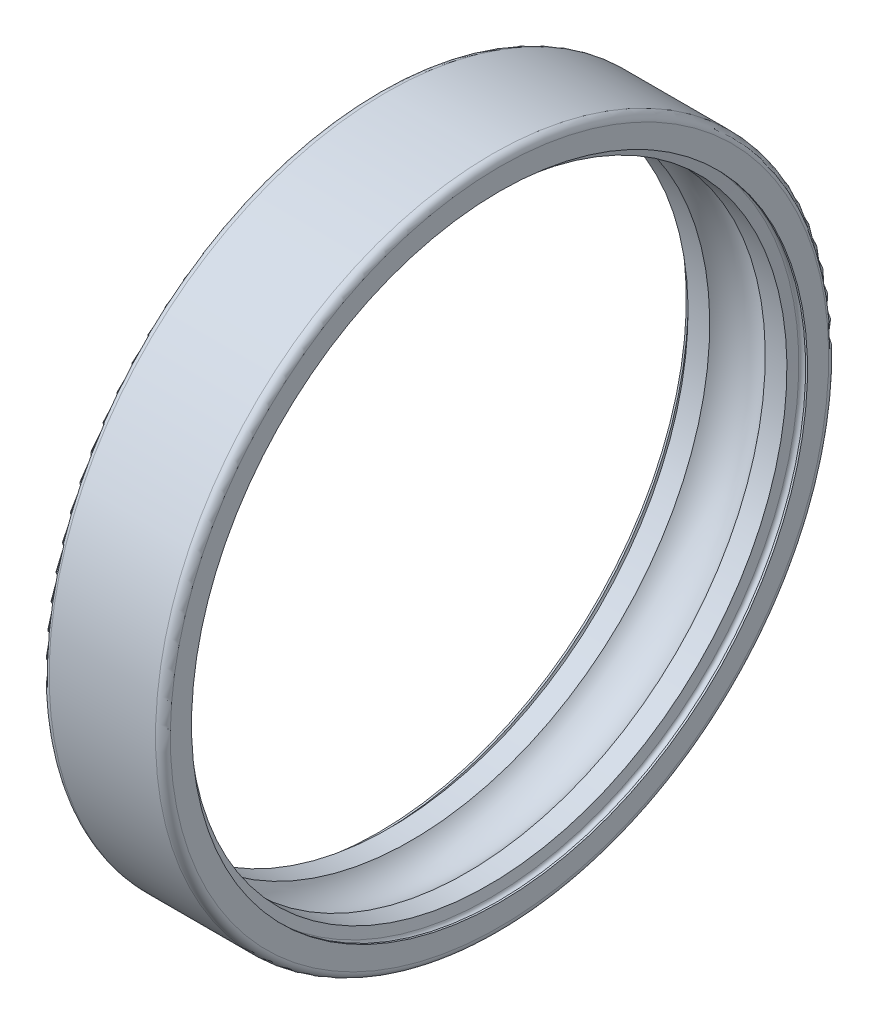
ISO-10303-21;
HEADER;
FILE_DESCRIPTION(('STEP AP214'),'2;1');
FILE_NAME('part.step','',(''),(''),'','','');
FILE_SCHEMA(('AUTOMOTIVE_DESIGN { 1 0 10303 214 1 1 1 1 }'));
ENDSEC;
DATA;
#1=APPLICATION_CONTEXT('core data for automotive mechanical design processes');
#2=APPLICATION_PROTOCOL_DEFINITION('international standard','automotive_design',2000,#1);
#3=PRODUCT_CONTEXT('',#1,'mechanical');
#4=PRODUCT('Part','Part','',(#3));
#5=PRODUCT_RELATED_PRODUCT_CATEGORY('part','',(#4));
#6=PRODUCT_DEFINITION_FORMATION('','',#4);
#7=PRODUCT_DEFINITION_CONTEXT('part definition',#1,'design');
#8=PRODUCT_DEFINITION('design','',#6,#7);
#9=PRODUCT_DEFINITION_SHAPE('','',#8);
#10=(LENGTH_UNIT() NAMED_UNIT(*) SI_UNIT(.MILLI.,.METRE.));
#11=(NAMED_UNIT(*) PLANE_ANGLE_UNIT() SI_UNIT($,.RADIAN.));
#12=(NAMED_UNIT(*) SI_UNIT($,.STERADIAN.) SOLID_ANGLE_UNIT());
#13=UNCERTAINTY_MEASURE_WITH_UNIT(LENGTH_MEASURE(1.E-05),#10,'distance_accuracy_value','');
#14=(GEOMETRIC_REPRESENTATION_CONTEXT(3) GLOBAL_UNCERTAINTY_ASSIGNED_CONTEXT((#13)) GLOBAL_UNIT_ASSIGNED_CONTEXT((#10,
#11,#12)) REPRESENTATION_CONTEXT('',''));
#15=CARTESIAN_POINT('',(0.,0.,0.));
#16=DIRECTION('',(0.,0.,1.));
#17=DIRECTION('',(1.,0.,0.));
#18=AXIS2_PLACEMENT_3D('',#15,#16,#17);
#19=CARTESIAN_POINT('',(17.16,0.,0.));
#20=DIRECTION('',(1.,0.,0.));
#21=DIRECTION('',(0.,0.,-1.));
#22=AXIS2_PLACEMENT_3D('',#19,#20,#21);
#23=TOROIDAL_SURFACE('',#22,45.75,0.56);
#24=CARTESIAN_POINT('',(17.72,0.,0.));
#25=DIRECTION('',(1.,0.,0.));
#26=DIRECTION('',(0.,1.,0.));
#27=AXIS2_PLACEMENT_3D('',#24,#25,#26);
#28=CIRCLE('',#27,45.75);
#29=CARTESIAN_POINT('',(17.72,45.75,0.));
#30=VERTEX_POINT('',#29);
#31=EDGE_CURVE('E11',#30,#30,#28,.T.);
#32=ORIENTED_EDGE('',*,*,#31,.T.);
#33=EDGE_LOOP('',(#32));
#34=FACE_BOUND('',#33,.T.);
#35=CARTESIAN_POINT('',(16.6085076583131,0.,0.));
#36=DIRECTION('',(1.,0.,0.));
#37=DIRECTION('',(0.,1.,0.));
#38=AXIS2_PLACEMENT_3D('',#35,#36,#37);
#39=CIRCLE('',#38,45.8472429794935);
#40=CARTESIAN_POINT('',(16.6085076583131,45.8472429794935,0.));
#41=VERTEX_POINT('',#40);
#42=EDGE_CURVE('E84',#41,#41,#39,.T.);
#43=ORIENTED_EDGE('',*,*,#42,.F.);
#44=EDGE_LOOP('',(#43));
#45=FACE_BOUND('',#44,.T.);
#46=ADVANCED_FACE('F17',(#34,#45),#23,.F.);
#47=CARTESIAN_POINT('',(17.86,0.,0.));
#48=DIRECTION('',(-1.,0.,0.));
#49=DIRECTION('',(0.,1.,0.));
#50=AXIS2_PLACEMENT_3D('',#47,#48,#49);
#51=CYLINDRICAL_SURFACE('',#50,45.75);
#52=CARTESIAN_POINT('',(18.,0.,0.));
#53=DIRECTION('',(1.,0.,0.));
#54=DIRECTION('',(0.,1.,0.));
#55=AXIS2_PLACEMENT_3D('',#52,#53,#54);
#56=CIRCLE('',#55,45.75);
#57=CARTESIAN_POINT('',(18.,45.75,0.));
#58=VERTEX_POINT('',#57);
#59=EDGE_CURVE('E27',#58,#58,#56,.T.);
#60=ORIENTED_EDGE('',*,*,#59,.T.);
#61=EDGE_LOOP('',(#60));
#62=FACE_BOUND('',#61,.T.);
#63=ORIENTED_EDGE('',*,*,#31,.F.);
#64=EDGE_LOOP('',(#63));
#65=FACE_BOUND('',#64,.T.);
#66=ADVANCED_FACE('F123',(#62,#65),#51,.F.);
#67=CARTESIAN_POINT('',(18.,47.325,0.));
#68=DIRECTION('',(1.,0.,0.));
#69=DIRECTION('',(0.,1.,0.));
#70=AXIS2_PLACEMENT_3D('',#67,#68,#69);
#71=PLANE('',#70);
#72=CARTESIAN_POINT('',(18.,0.,0.));
#73=DIRECTION('',(1.,0.,0.));
#74=DIRECTION('',(0.,1.,0.));
#75=AXIS2_PLACEMENT_3D('',#72,#73,#74);
#76=CIRCLE('',#75,48.9);
#77=CARTESIAN_POINT('',(18.,48.9,0.));
#78=VERTEX_POINT('',#77);
#79=EDGE_CURVE('E89',#78,#78,#76,.T.);
#80=ORIENTED_EDGE('',*,*,#79,.T.);
#81=EDGE_LOOP('',(#80));
#82=FACE_BOUND('',#81,.T.);
#83=ORIENTED_EDGE('',*,*,#59,.F.);
#84=EDGE_LOOP('',(#83));
#85=FACE_BOUND('',#84,.T.);
#86=ADVANCED_FACE('F127',(#82,#85),#71,.T.);
#87=CARTESIAN_POINT('',(16.9,0.,0.));
#88=DIRECTION('',(1.,0.,0.));
#89=DIRECTION('',(0.,0.,-1.));
#90=AXIS2_PLACEMENT_3D('',#87,#88,#89);
#91=TOROIDAL_SURFACE('',#90,48.9,1.1);
#92=CARTESIAN_POINT('',(16.9,0.,0.));
#93=DIRECTION('',(1.,0.,0.));
#94=DIRECTION('',(0.,1.,0.));
#95=AXIS2_PLACEMENT_3D('',#92,#93,#94);
#96=CIRCLE('',#95,50.);
#97=CARTESIAN_POINT('',(16.9,50.,0.));
#98=VERTEX_POINT('',#97);
#99=EDGE_CURVE('E87',#98,#98,#96,.T.);
#100=ORIENTED_EDGE('',*,*,#99,.T.);
#101=EDGE_LOOP('',(#100));
#102=FACE_BOUND('',#101,.T.);
#103=ORIENTED_EDGE('',*,*,#79,.F.);
#104=EDGE_LOOP('',(#103));
#105=FACE_BOUND('',#104,.T.);
#106=ADVANCED_FACE('F131',(#102,#105),#91,.T.);
#107=CARTESIAN_POINT('',(9.,0.,0.));
#108=DIRECTION('',(-1.,0.,0.));
#109=DIRECTION('',(0.,1.,0.));
#110=AXIS2_PLACEMENT_3D('',#107,#108,#109);
#111=CYLINDRICAL_SURFACE('',#110,50.);
#112=CARTESIAN_POINT('',(1.1,0.,0.));
#113=DIRECTION('',(1.,0.,0.));
#114=DIRECTION('',(0.,1.,0.));
#115=AXIS2_PLACEMENT_3D('',#112,#113,#114);
#116=CIRCLE('',#115,50.);
#117=CARTESIAN_POINT('',(1.1,50.,0.));
#118=VERTEX_POINT('',#117);
#119=EDGE_CURVE('E85',#118,#118,#116,.T.);
#120=ORIENTED_EDGE('',*,*,#119,.T.);
#121=EDGE_LOOP('',(#120));
#122=FACE_BOUND('',#121,.T.);
#123=ORIENTED_EDGE('',*,*,#99,.F.);
#124=EDGE_LOOP('',(#123));
#125=FACE_BOUND('',#124,.T.);
#126=ADVANCED_FACE('F133',(#122,#125),#111,.T.);
#127=CARTESIAN_POINT('',(1.1,0.,0.));
#128=DIRECTION('',(1.,0.,0.));
#129=DIRECTION('',(0.,0.,-1.));
#130=AXIS2_PLACEMENT_3D('',#127,#128,#129);
#131=TOROIDAL_SURFACE('',#130,48.9,1.1);
#132=CARTESIAN_POINT('',(0.,0.,0.));
#133=DIRECTION('',(1.,0.,0.));
#134=DIRECTION('',(0.,1.,0.));
#135=AXIS2_PLACEMENT_3D('',#132,#133,#134);
#136=CIRCLE('',#135,48.9);
#137=CARTESIAN_POINT('',(0.,48.9,0.));
#138=VERTEX_POINT('',#137);
#139=EDGE_CURVE('E88',#138,#138,#136,.T.);
#140=ORIENTED_EDGE('',*,*,#139,.T.);
#141=EDGE_LOOP('',(#140));
#142=FACE_BOUND('',#141,.T.);
#143=ORIENTED_EDGE('',*,*,#119,.F.);
#144=EDGE_LOOP('',(#143));
#145=FACE_BOUND('',#144,.T.);
#146=ADVANCED_FACE('F158',(#142,#145),#131,.T.);
#147=CARTESIAN_POINT('',(0.,47.325,0.));
#148=DIRECTION('',(-1.,0.,0.));
#149=DIRECTION('',(0.,-1.,0.));
#150=AXIS2_PLACEMENT_3D('',#147,#148,#149);
#151=PLANE('',#150);
#152=CARTESIAN_POINT('',(0.,0.,0.));
#153=DIRECTION('',(1.,0.,0.));
#154=DIRECTION('',(0.,1.,0.));
#155=AXIS2_PLACEMENT_3D('',#152,#153,#154);
#156=CIRCLE('',#155,45.75);
#157=CARTESIAN_POINT('',(0.,45.75,0.));
#158=VERTEX_POINT('',#157);
#159=EDGE_CURVE('E90',#158,#158,#156,.T.);
#160=ORIENTED_EDGE('',*,*,#159,.T.);
#161=EDGE_LOOP('',(#160));
#162=FACE_BOUND('',#161,.T.);
#163=ORIENTED_EDGE('',*,*,#139,.F.);
#164=EDGE_LOOP('',(#163));
#165=FACE_BOUND('',#164,.T.);
#166=ADVANCED_FACE('F150',(#162,#165),#151,.T.);
#167=CARTESIAN_POINT('',(0.14,0.,0.));
#168=DIRECTION('',(-1.,0.,0.));
#169=DIRECTION('',(0.,1.,0.));
#170=AXIS2_PLACEMENT_3D('',#167,#168,#169);
#171=CYLINDRICAL_SURFACE('',#170,45.75);
#172=CARTESIAN_POINT('',(0.28,0.,0.));
#173=DIRECTION('',(1.,0.,0.));
#174=DIRECTION('',(0.,1.,0.));
#175=AXIS2_PLACEMENT_3D('',#172,#173,#174);
#176=CIRCLE('',#175,45.75);
#177=CARTESIAN_POINT('',(0.28,45.75,0.));
#178=VERTEX_POINT('',#177);
#179=EDGE_CURVE('E76',#178,#178,#176,.T.);
#180=ORIENTED_EDGE('',*,*,#179,.T.);
#181=EDGE_LOOP('',(#180));
#182=FACE_BOUND('',#181,.T.);
#183=ORIENTED_EDGE('',*,*,#159,.F.);
#184=EDGE_LOOP('',(#183));
#185=FACE_BOUND('',#184,.T.);
#186=ADVANCED_FACE('F145',(#182,#185),#171,.F.);
#187=CARTESIAN_POINT('',(0.84,0.,0.));
#188=DIRECTION('',(1.,0.,0.));
#189=DIRECTION('',(0.,0.,-1.));
#190=AXIS2_PLACEMENT_3D('',#187,#188,#189);
#191=TOROIDAL_SURFACE('',#190,45.75,0.56);
#192=CARTESIAN_POINT('',(1.39149234168683,0.,0.));
#193=DIRECTION('',(1.,0.,0.));
#194=DIRECTION('',(0.,1.,0.));
#195=AXIS2_PLACEMENT_3D('',#192,#193,#194);
#196=CIRCLE('',#195,45.8472429794935);
#197=CARTESIAN_POINT('',(1.39149234168683,45.8472429794935,0.));
#198=VERTEX_POINT('',#197);
#199=EDGE_CURVE('E67',#198,#198,#196,.T.);
#200=ORIENTED_EDGE('',*,*,#199,.T.);
#201=EDGE_LOOP('',(#200));
#202=FACE_BOUND('',#201,.T.);
#203=ORIENTED_EDGE('',*,*,#179,.F.);
#204=EDGE_LOOP('',(#203));
#205=FACE_BOUND('',#204,.T.);
#206=ADVANCED_FACE('F140',(#202,#205),#191,.F.);
#207=CARTESIAN_POINT('',(1.52349450866735,0.,0.));
#208=DIRECTION('',(-1.,0.,0.));
#209=DIRECTION('',(0.,1.,0.));
#210=AXIS2_PLACEMENT_3D('',#207,#208,#209);
#211=CONICAL_SURFACE('',#210,45.0986214897467,1.39626340159546);
#212=CARTESIAN_POINT('',(1.65549667564787,0.,0.));
#213=DIRECTION('',(1.,0.,0.));
#214=DIRECTION('',(0.,1.,0.));
#215=AXIS2_PLACEMENT_3D('',#212,#213,#214);
#216=CIRCLE('',#215,44.35);
#217=CARTESIAN_POINT('',(1.65549667564787,44.35,0.));
#218=VERTEX_POINT('',#217);
#219=EDGE_CURVE('E72',#218,#218,#216,.T.);
#220=ORIENTED_EDGE('',*,*,#219,.T.);
#221=EDGE_LOOP('',(#220));
#222=FACE_BOUND('',#221,.T.);
#223=ORIENTED_EDGE('',*,*,#199,.F.);
#224=EDGE_LOOP('',(#223));
#225=FACE_BOUND('',#224,.T.);
#226=ADVANCED_FACE('F19',(#222,#225),#211,.F.);
#227=CARTESIAN_POINT('',(3.26556258903698,0.,0.));
#228=DIRECTION('',(-1.,0.,0.));
#229=DIRECTION('',(0.,1.,0.));
#230=AXIS2_PLACEMENT_3D('',#227,#228,#229);
#231=CYLINDRICAL_SURFACE('',#230,44.35);
#232=CARTESIAN_POINT('',(4.87562850242609,0.,0.));
#233=DIRECTION('',(1.,0.,0.));
#234=DIRECTION('',(0.,1.,0.));
#235=AXIS2_PLACEMENT_3D('',#232,#233,#234);
#236=CIRCLE('',#235,44.35);
#237=CARTESIAN_POINT('',(4.87562850242609,44.35,0.));
#238=VERTEX_POINT('',#237);
#239=EDGE_CURVE('E21',#238,#238,#236,.T.);
#240=ORIENTED_EDGE('',*,*,#239,.T.);
#241=EDGE_LOOP('',(#240));
#242=FACE_BOUND('',#241,.T.);
#243=ORIENTED_EDGE('',*,*,#219,.F.);
#244=EDGE_LOOP('',(#243));
#245=FACE_BOUND('',#244,.T.);
#246=ADVANCED_FACE('F118',(#242,#245),#231,.F.);
#247=CARTESIAN_POINT('',(9.,0.,0.));
#248=DIRECTION('',(1.,0.,0.));
#249=DIRECTION('',(0.,0.,-1.));
#250=AXIS2_PLACEMENT_3D('',#247,#248,#249);
#251=TOROIDAL_SURFACE('',#250,41.25,5.1595);
#252=CARTESIAN_POINT('',(13.1243714975739,0.,0.));
#253=DIRECTION('',(1.,0.,0.));
#254=DIRECTION('',(0.,1.,0.));
#255=AXIS2_PLACEMENT_3D('',#252,#253,#254);
#256=CIRCLE('',#255,44.35);
#257=CARTESIAN_POINT('',(13.1243714975739,44.35,0.));
#258=VERTEX_POINT('',#257);
#259=EDGE_CURVE('E78',#258,#258,#256,.T.);
#260=ORIENTED_EDGE('',*,*,#259,.T.);
#261=EDGE_LOOP('',(#260));
#262=FACE_BOUND('',#261,.T.);
#263=ORIENTED_EDGE('',*,*,#239,.F.);
#264=EDGE_LOOP('',(#263));
#265=FACE_BOUND('',#264,.T.);
#266=ADVANCED_FACE('F104',(#262,#265),#251,.F.);
#267=CARTESIAN_POINT('',(14.734437410963,0.,0.));
#268=DIRECTION('',(-1.,0.,0.));
#269=DIRECTION('',(0.,1.,0.));
#270=AXIS2_PLACEMENT_3D('',#267,#268,#269);
#271=CYLINDRICAL_SURFACE('',#270,44.35);
#272=CARTESIAN_POINT('',(16.3445033243522,0.,0.));
#273=DIRECTION('',(1.,0.,0.));
#274=DIRECTION('',(0.,1.,0.));
#275=AXIS2_PLACEMENT_3D('',#272,#273,#274);
#276=CIRCLE('',#275,44.35);
#277=CARTESIAN_POINT('',(16.3445033243522,44.35,0.));
#278=VERTEX_POINT('',#277);
#279=EDGE_CURVE('E82',#278,#278,#276,.T.);
#280=ORIENTED_EDGE('',*,*,#279,.T.);
#281=EDGE_LOOP('',(#280));
#282=FACE_BOUND('',#281,.T.);
#283=ORIENTED_EDGE('',*,*,#259,.F.);
#284=EDGE_LOOP('',(#283));
#285=FACE_BOUND('',#284,.T.);
#286=ADVANCED_FACE('F107',(#282,#285),#271,.F.);
#287=CARTESIAN_POINT('',(16.4765054913327,0.,0.));
#288=DIRECTION('',(1.,0.,0.));
#289=DIRECTION('',(0.,1.,0.));
#290=AXIS2_PLACEMENT_3D('',#287,#288,#289);
#291=CONICAL_SURFACE('',#290,45.0986214897467,1.39626340159546);
#292=ORIENTED_EDGE('',*,*,#42,.T.);
#293=EDGE_LOOP('',(#292));
#294=FACE_BOUND('',#293,.T.);
#295=ORIENTED_EDGE('',*,*,#279,.F.);
#296=EDGE_LOOP('',(#295));
#297=FACE_BOUND('',#296,.T.);
#298=ADVANCED_FACE('F109',(#294,#297),#291,.F.);
#299=CLOSED_SHELL('',(#46,#66,#86,#106,#126,#146,#166,#186,#206,#226,#246,#266,#286,#298));
#300=MANIFOLD_SOLID_BREP('B1',#299);
#301=ADVANCED_BREP_SHAPE_REPRESENTATION('',(#18,#300),#14);
#302=SHAPE_DEFINITION_REPRESENTATION(#9,#301);
ENDSEC;
END-ISO-10303-21;
